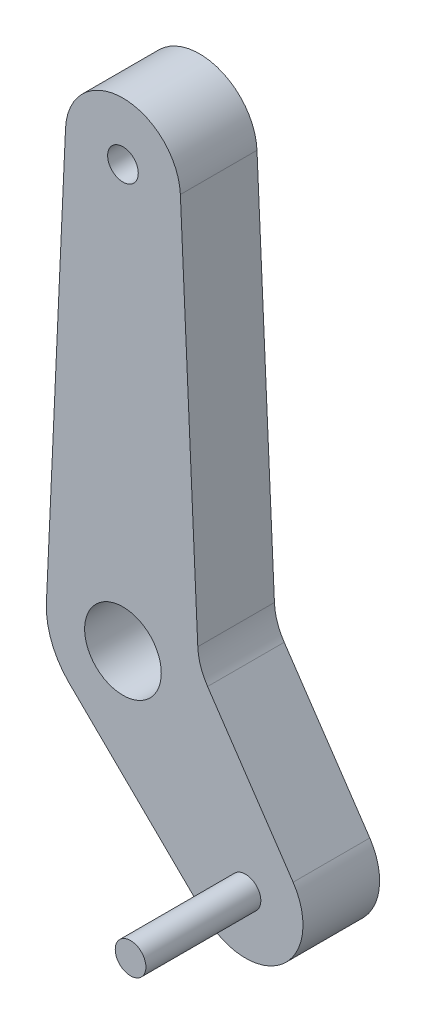
ISO-10303-21;
HEADER;
FILE_DESCRIPTION(('STEP AP214'),'2;1');
FILE_NAME('part.step','',(''),(''),'','','');
FILE_SCHEMA(('AUTOMOTIVE_DESIGN { 1 0 10303 214 1 1 1 1 }'));
ENDSEC;
DATA;
#1=APPLICATION_CONTEXT('core data for automotive mechanical design processes');
#2=APPLICATION_PROTOCOL_DEFINITION('international standard','automotive_design',2000,#1);
#3=PRODUCT_CONTEXT('',#1,'mechanical');
#4=PRODUCT('Part','Part','',(#3));
#5=PRODUCT_RELATED_PRODUCT_CATEGORY('part','',(#4));
#6=PRODUCT_DEFINITION_FORMATION('','',#4);
#7=PRODUCT_DEFINITION_CONTEXT('part definition',#1,'design');
#8=PRODUCT_DEFINITION('design','',#6,#7);
#9=PRODUCT_DEFINITION_SHAPE('','',#8);
#10=(LENGTH_UNIT() NAMED_UNIT(*) SI_UNIT(.MILLI.,.METRE.));
#11=(NAMED_UNIT(*) PLANE_ANGLE_UNIT() SI_UNIT($,.RADIAN.));
#12=(NAMED_UNIT(*) SI_UNIT($,.STERADIAN.) SOLID_ANGLE_UNIT());
#13=UNCERTAINTY_MEASURE_WITH_UNIT(LENGTH_MEASURE(1.E-05),#10,'distance_accuracy_value','');
#14=(GEOMETRIC_REPRESENTATION_CONTEXT(3) GLOBAL_UNCERTAINTY_ASSIGNED_CONTEXT((#13)) GLOBAL_UNIT_ASSIGNED_CONTEXT((#10,
#11,#12)) REPRESENTATION_CONTEXT('',''));
#15=CARTESIAN_POINT('',(0.,0.,0.));
#16=DIRECTION('',(0.,0.,1.));
#17=DIRECTION('',(1.,0.,0.));
#18=AXIS2_PLACEMENT_3D('',#15,#16,#17);
#19=CARTESIAN_POINT('',(34.5162567100584,11.4272183740973,20.));
#20=DIRECTION('',(0.,0.,-1.));
#21=DIRECTION('',(-1.,0.,0.));
#22=AXIS2_PLACEMENT_3D('',#19,#20,#21);
#23=PLANE('',#22);
#24=CARTESIAN_POINT('',(31.9853669723108,-38.4309289459233,20.));
#25=DIRECTION('',(0.,0.,-1.));
#26=DIRECTION('',(-1.,0.,0.));
#27=AXIS2_PLACEMENT_3D('',#24,#25,#26);
#28=CIRCLE('',#27,4.00000000000001);
#29=CARTESIAN_POINT('',(27.9853669723108,-38.4309289459233,20.));
#30=VERTEX_POINT('',#29);
#31=EDGE_CURVE('E11',#30,#30,#28,.F.);
#32=ORIENTED_EDGE('',*,*,#31,.F.);
#33=EDGE_LOOP('',(#32));
#34=FACE_BOUND('',#33,.T.);
#35=CARTESIAN_POINT('',(34.5162567100584,11.4272183740973,20.));
#36=DIRECTION('',(0.,0.,-1.));
#37=DIRECTION('',(-1.,0.,0.));
#38=AXIS2_PLACEMENT_3D('',#35,#36,#37);
#39=CIRCLE('',#38,15.);
#40=CARTESIAN_POINT('',(22.0852082516299,3.03263474986665,20.));
#41=VERTEX_POINT('',#40);
#42=CARTESIAN_POINT('',(19.5317605901703,10.7454001922791,20.));
#43=VERTEX_POINT('',#42);
#44=EDGE_CURVE('E171',#41,#43,#39,.T.);
#45=ORIENTED_EDGE('',*,*,#44,.T.);
#46=DIRECTION('',(-0.0454545454545449,0.998966407992541,0.));
#47=VECTOR('',#46,1.);
#48=CARTESIAN_POINT('',(14.9844961198881,110.681818181818,20.));
#49=LINE('',#48,#47);
#50=CARTESIAN_POINT('',(14.9844961198881,110.681818181818,20.));
#51=VERTEX_POINT('',#50);
#52=EDGE_CURVE('E107',#43,#51,#49,.T.);
#53=ORIENTED_EDGE('',*,*,#52,.T.);
#54=CARTESIAN_POINT('',(0.,110.,20.));
#55=DIRECTION('',(0.,0.,1.));
#56=DIRECTION('',(1.,0.,0.));
#57=AXIS2_PLACEMENT_3D('',#54,#55,#56);
#58=CIRCLE('',#57,15.);
#59=CARTESIAN_POINT('',(-14.9844961198881,110.681818181818,20.));
#60=VERTEX_POINT('',#59);
#61=EDGE_CURVE('E211',#51,#60,#58,.T.);
#62=ORIENTED_EDGE('',*,*,#61,.T.);
#63=DIRECTION('',(-0.0454545454545454,-0.998966407992541,0.));
#64=VECTOR('',#63,1.);
#65=CARTESIAN_POINT('',(-14.9844961198881,110.681818181818,20.));
#66=LINE('',#65,#64);
#67=CARTESIAN_POINT('',(-19.9793281598508,0.909090909090913,20.));
#68=VERTEX_POINT('',#67);
#69=EDGE_CURVE('E209',#60,#68,#66,.T.);
#70=ORIENTED_EDGE('',*,*,#69,.T.);
#71=CARTESIAN_POINT('',(0.,0.,20.));
#72=DIRECTION('',(0.,0.,1.));
#73=DIRECTION('',(1.,0.,0.));
#74=AXIS2_PLACEMENT_3D('',#71,#72,#73);
#75=CIRCLE('',#74,20.);
#76=CARTESIAN_POINT('',(-14.0159019201199,-14.2672524813146,20.));
#77=VERTEX_POINT('',#76);
#78=EDGE_CURVE('E126',#68,#77,#75,.T.);
#79=ORIENTED_EDGE('',*,*,#78,.T.);
#80=DIRECTION('',(0.713362624065732,-0.700795096005996,0.));
#81=VECTOR('',#80,1.);
#82=CARTESIAN_POINT('',(-14.0159019201199,-14.2672524813146,20.));
#83=LINE('',#82,#81);
#84=CARTESIAN_POINT('',(21.4734405322209,-49.1313683069093,20.));
#85=VERTEX_POINT('',#84);
#86=EDGE_CURVE('E120',#77,#85,#83,.T.);
#87=ORIENTED_EDGE('',*,*,#86,.T.);
#88=CARTESIAN_POINT('',(31.9853669723108,-38.4309289459233,20.));
#89=DIRECTION('',(0.,0.,1.));
#90=DIRECTION('',(1.,0.,0.));
#91=AXIS2_PLACEMENT_3D('',#88,#89,#90);
#92=CIRCLE('',#91,15.);
#93=CARTESIAN_POINT('',(44.4164154307394,-30.0363453216928,20.));
#94=VERTEX_POINT('',#93);
#95=EDGE_CURVE('E124',#85,#94,#92,.T.);
#96=ORIENTED_EDGE('',*,*,#95,.T.);
#97=DIRECTION('',(-0.559638908282038,0.82873656389524,0.));
#98=VECTOR('',#97,1.);
#99=CARTESIAN_POINT('',(44.4164154307394,-30.0363453216928,20.));
#100=LINE('',#99,#98);
#101=EDGE_CURVE('E63',#94,#41,#100,.T.);
#102=ORIENTED_EDGE('',*,*,#101,.T.);
#103=EDGE_LOOP('',(#45,#53,#62,#70,#79,#87,#96,#102));
#104=FACE_BOUND('',#103,.T.);
#105=CARTESIAN_POINT('',(0.,0.,20.));
#106=DIRECTION('',(0.,0.,1.));
#107=DIRECTION('',(1.,0.,0.));
#108=AXIS2_PLACEMENT_3D('',#105,#106,#107);
#109=CIRCLE('',#108,10.);
#110=CARTESIAN_POINT('',(10.,0.,20.));
#111=VERTEX_POINT('',#110);
#112=EDGE_CURVE('E153',#111,#111,#109,.T.);
#113=ORIENTED_EDGE('',*,*,#112,.F.);
#114=EDGE_LOOP('',(#113));
#115=FACE_BOUND('',#114,.T.);
#116=CARTESIAN_POINT('',(0.,110.,20.));
#117=DIRECTION('',(0.,0.,1.));
#118=DIRECTION('',(1.,0.,0.));
#119=AXIS2_PLACEMENT_3D('',#116,#117,#118);
#120=CIRCLE('',#119,4.);
#121=CARTESIAN_POINT('',(4.,110.,20.));
#122=VERTEX_POINT('',#121);
#123=EDGE_CURVE('E225',#122,#122,#120,.T.);
#124=ORIENTED_EDGE('',*,*,#123,.F.);
#125=EDGE_LOOP('',(#124));
#126=FACE_BOUND('',#125,.T.);
#127=ADVANCED_FACE('F45',(#34,#104,#115,#126),#23,.F.);
#128=CARTESIAN_POINT('',(34.5162567100584,11.4272183740973,0.));
#129=DIRECTION('',(0.,0.,-1.));
#130=DIRECTION('',(-1.,0.,0.));
#131=AXIS2_PLACEMENT_3D('',#128,#129,#130);
#132=PLANE('',#131);
#133=CARTESIAN_POINT('',(0.,0.,0.));
#134=DIRECTION('',(0.,0.,1.));
#135=DIRECTION('',(1.,0.,0.));
#136=AXIS2_PLACEMENT_3D('',#133,#134,#135);
#137=CIRCLE('',#136,10.);
#138=CARTESIAN_POINT('',(10.,0.,0.));
#139=VERTEX_POINT('',#138);
#140=EDGE_CURVE('E221',#139,#139,#137,.T.);
#141=ORIENTED_EDGE('',*,*,#140,.T.);
#142=EDGE_LOOP('',(#141));
#143=FACE_BOUND('',#142,.T.);
#144=CARTESIAN_POINT('',(34.5162567100584,11.4272183740973,0.));
#145=DIRECTION('',(0.,0.,-1.));
#146=DIRECTION('',(-1.,0.,0.));
#147=AXIS2_PLACEMENT_3D('',#144,#145,#146);
#148=CIRCLE('',#147,15.);
#149=CARTESIAN_POINT('',(22.0852082516299,3.03263474986665,0.));
#150=VERTEX_POINT('',#149);
#151=CARTESIAN_POINT('',(19.5317605901703,10.7454001922791,0.));
#152=VERTEX_POINT('',#151);
#153=EDGE_CURVE('E148',#150,#152,#148,.T.);
#154=ORIENTED_EDGE('',*,*,#153,.F.);
#155=DIRECTION('',(-0.559638908282038,0.82873656389524,0.));
#156=VECTOR('',#155,1.);
#157=CARTESIAN_POINT('',(44.4164154307394,-30.0363453216928,0.));
#158=LINE('',#157,#156);
#159=CARTESIAN_POINT('',(44.4164154307394,-30.0363453216928,0.));
#160=VERTEX_POINT('',#159);
#161=EDGE_CURVE('E98',#160,#150,#158,.T.);
#162=ORIENTED_EDGE('',*,*,#161,.F.);
#163=CARTESIAN_POINT('',(31.9853669723108,-38.4309289459233,0.));
#164=DIRECTION('',(0.,0.,1.));
#165=DIRECTION('',(1.,0.,0.));
#166=AXIS2_PLACEMENT_3D('',#163,#164,#165);
#167=CIRCLE('',#166,15.);
#168=CARTESIAN_POINT('',(21.4734405322209,-49.1313683069093,0.));
#169=VERTEX_POINT('',#168);
#170=EDGE_CURVE('E92',#169,#160,#167,.T.);
#171=ORIENTED_EDGE('',*,*,#170,.F.);
#172=DIRECTION('',(0.713362624065732,-0.700795096005996,0.));
#173=VECTOR('',#172,1.);
#174=CARTESIAN_POINT('',(-14.0159019201199,-14.2672524813146,0.));
#175=LINE('',#174,#173);
#176=CARTESIAN_POINT('',(-14.0159019201199,-14.2672524813146,0.));
#177=VERTEX_POINT('',#176);
#178=EDGE_CURVE('E135',#177,#169,#175,.T.);
#179=ORIENTED_EDGE('',*,*,#178,.F.);
#180=CARTESIAN_POINT('',(0.,0.,0.));
#181=DIRECTION('',(0.,0.,1.));
#182=DIRECTION('',(1.,0.,0.));
#183=AXIS2_PLACEMENT_3D('',#180,#181,#182);
#184=CIRCLE('',#183,20.);
#185=CARTESIAN_POINT('',(-19.9793281598508,0.909090909090913,0.));
#186=VERTEX_POINT('',#185);
#187=EDGE_CURVE('E162',#186,#177,#184,.T.);
#188=ORIENTED_EDGE('',*,*,#187,.F.);
#189=DIRECTION('',(-0.0454545454545454,-0.998966407992541,0.));
#190=VECTOR('',#189,1.);
#191=CARTESIAN_POINT('',(-14.9844961198881,110.681818181818,0.));
#192=LINE('',#191,#190);
#193=CARTESIAN_POINT('',(-14.9844961198881,110.681818181818,0.));
#194=VERTEX_POINT('',#193);
#195=EDGE_CURVE('E159',#194,#186,#192,.T.);
#196=ORIENTED_EDGE('',*,*,#195,.F.);
#197=CARTESIAN_POINT('',(0.,110.,0.));
#198=DIRECTION('',(0.,0.,1.));
#199=DIRECTION('',(1.,0.,0.));
#200=AXIS2_PLACEMENT_3D('',#197,#198,#199);
#201=CIRCLE('',#200,15.);
#202=CARTESIAN_POINT('',(14.9844961198881,110.681818181818,0.));
#203=VERTEX_POINT('',#202);
#204=EDGE_CURVE('E156',#203,#194,#201,.T.);
#205=ORIENTED_EDGE('',*,*,#204,.F.);
#206=DIRECTION('',(-0.0454545454545449,0.998966407992541,0.));
#207=VECTOR('',#206,1.);
#208=CARTESIAN_POINT('',(14.9844961198881,110.681818181818,0.));
#209=LINE('',#208,#207);
#210=EDGE_CURVE('E152',#152,#203,#209,.T.);
#211=ORIENTED_EDGE('',*,*,#210,.F.);
#212=EDGE_LOOP('',(#154,#162,#171,#179,#188,#196,#205,#211));
#213=FACE_BOUND('',#212,.T.);
#214=CARTESIAN_POINT('',(0.,110.,0.));
#215=DIRECTION('',(0.,0.,1.));
#216=DIRECTION('',(1.,0.,0.));
#217=AXIS2_PLACEMENT_3D('',#214,#215,#216);
#218=CIRCLE('',#217,4.);
#219=CARTESIAN_POINT('',(4.,110.,0.));
#220=VERTEX_POINT('',#219);
#221=EDGE_CURVE('E229',#220,#220,#218,.T.);
#222=ORIENTED_EDGE('',*,*,#221,.T.);
#223=EDGE_LOOP('',(#222));
#224=FACE_BOUND('',#223,.T.);
#225=ADVANCED_FACE('F196',(#143,#213,#224),#132,.T.);
#226=CARTESIAN_POINT('',(34.5162567100584,11.4272183740973,20.));
#227=DIRECTION('',(0.,0.,-1.));
#228=DIRECTION('',(-1.,0.,0.));
#229=AXIS2_PLACEMENT_3D('',#226,#227,#228);
#230=CYLINDRICAL_SURFACE('',#229,15.);
#231=ORIENTED_EDGE('',*,*,#153,.T.);
#232=DIRECTION('',(0.,0.,-1.));
#233=VECTOR('',#232,1.);
#234=CARTESIAN_POINT('',(19.5317605901703,10.7454001922791,20.));
#235=LINE('',#234,#233);
#236=EDGE_CURVE('E55',#43,#152,#235,.T.);
#237=ORIENTED_EDGE('',*,*,#236,.F.);
#238=ORIENTED_EDGE('',*,*,#44,.F.);
#239=DIRECTION('',(0.,0.,-1.));
#240=VECTOR('',#239,1.);
#241=CARTESIAN_POINT('',(22.0852082516299,3.03263474986665,20.));
#242=LINE('',#241,#240);
#243=EDGE_CURVE('E144',#41,#150,#242,.T.);
#244=ORIENTED_EDGE('',*,*,#243,.T.);
#245=EDGE_LOOP('',(#231,#237,#238,#244));
#246=FACE_BOUND('',#245,.T.);
#247=ADVANCED_FACE('F47',(#246),#230,.F.);
#248=CARTESIAN_POINT('',(14.9844961198881,110.681818181818,20.));
#249=DIRECTION('',(-0.998966407992541,-0.0454545454545449,0.));
#250=DIRECTION('',(0.0454545454545449,-0.998966407992541,0.));
#251=AXIS2_PLACEMENT_3D('',#248,#249,#250);
#252=PLANE('',#251);
#253=ORIENTED_EDGE('',*,*,#210,.T.);
#254=DIRECTION('',(0.,0.,-1.));
#255=VECTOR('',#254,1.);
#256=CARTESIAN_POINT('',(14.9844961198881,110.681818181818,20.));
#257=LINE('',#256,#255);
#258=EDGE_CURVE('E186',#51,#203,#257,.T.);
#259=ORIENTED_EDGE('',*,*,#258,.F.);
#260=ORIENTED_EDGE('',*,*,#52,.F.);
#261=ORIENTED_EDGE('',*,*,#236,.T.);
#262=EDGE_LOOP('',(#253,#259,#260,#261));
#263=FACE_BOUND('',#262,.T.);
#264=ADVANCED_FACE('F191',(#263),#252,.F.);
#265=CARTESIAN_POINT('',(0.,110.,20.));
#266=DIRECTION('',(0.,0.,-1.));
#267=DIRECTION('',(-1.,0.,0.));
#268=AXIS2_PLACEMENT_3D('',#265,#266,#267);
#269=CYLINDRICAL_SURFACE('',#268,15.);
#270=ORIENTED_EDGE('',*,*,#204,.T.);
#271=DIRECTION('',(0.,0.,-1.));
#272=VECTOR('',#271,1.);
#273=CARTESIAN_POINT('',(-14.9844961198881,110.681818181818,20.));
#274=LINE('',#273,#272);
#275=EDGE_CURVE('E182',#60,#194,#274,.T.);
#276=ORIENTED_EDGE('',*,*,#275,.F.);
#277=ORIENTED_EDGE('',*,*,#61,.F.);
#278=ORIENTED_EDGE('',*,*,#258,.T.);
#279=EDGE_LOOP('',(#270,#276,#277,#278));
#280=FACE_BOUND('',#279,.T.);
#281=ADVANCED_FACE('F203',(#280),#269,.T.);
#282=CARTESIAN_POINT('',(-14.9844961198881,110.681818181818,20.));
#283=DIRECTION('',(0.998966407992541,-0.0454545454545454,0.));
#284=DIRECTION('',(0.0454545454545454,0.998966407992541,0.));
#285=AXIS2_PLACEMENT_3D('',#282,#283,#284);
#286=PLANE('',#285);
#287=ORIENTED_EDGE('',*,*,#195,.T.);
#288=DIRECTION('',(0.,0.,-1.));
#289=VECTOR('',#288,1.);
#290=CARTESIAN_POINT('',(-19.9793281598508,0.909090909090913,20.));
#291=LINE('',#290,#289);
#292=EDGE_CURVE('E178',#68,#186,#291,.T.);
#293=ORIENTED_EDGE('',*,*,#292,.F.);
#294=ORIENTED_EDGE('',*,*,#69,.F.);
#295=ORIENTED_EDGE('',*,*,#275,.T.);
#296=EDGE_LOOP('',(#287,#293,#294,#295));
#297=FACE_BOUND('',#296,.T.);
#298=ADVANCED_FACE('F207',(#297),#286,.F.);
#299=CARTESIAN_POINT('',(0.,0.,20.));
#300=DIRECTION('',(0.,0.,-1.));
#301=DIRECTION('',(-1.,0.,0.));
#302=AXIS2_PLACEMENT_3D('',#299,#300,#301);
#303=CYLINDRICAL_SURFACE('',#302,20.);
#304=ORIENTED_EDGE('',*,*,#187,.T.);
#305=DIRECTION('',(0.,0.,-1.));
#306=VECTOR('',#305,1.);
#307=CARTESIAN_POINT('',(-14.0159019201199,-14.2672524813146,20.));
#308=LINE('',#307,#306);
#309=EDGE_CURVE('E137',#77,#177,#308,.T.);
#310=ORIENTED_EDGE('',*,*,#309,.F.);
#311=ORIENTED_EDGE('',*,*,#78,.F.);
#312=ORIENTED_EDGE('',*,*,#292,.T.);
#313=EDGE_LOOP('',(#304,#310,#311,#312));
#314=FACE_BOUND('',#313,.T.);
#315=ADVANCED_FACE('F269',(#314),#303,.T.);
#316=CARTESIAN_POINT('',(-14.0159019201199,-14.2672524813146,20.));
#317=DIRECTION('',(0.700795096005996,0.713362624065732,0.));
#318=DIRECTION('',(-0.713362624065732,0.700795096005996,0.));
#319=AXIS2_PLACEMENT_3D('',#316,#317,#318);
#320=PLANE('',#319);
#321=ORIENTED_EDGE('',*,*,#178,.T.);
#322=DIRECTION('',(0.,0.,-1.));
#323=VECTOR('',#322,1.);
#324=CARTESIAN_POINT('',(21.4734405322209,-49.1313683069093,20.));
#325=LINE('',#324,#323);
#326=EDGE_CURVE('E132',#85,#169,#325,.T.);
#327=ORIENTED_EDGE('',*,*,#326,.F.);
#328=ORIENTED_EDGE('',*,*,#86,.F.);
#329=ORIENTED_EDGE('',*,*,#309,.T.);
#330=EDGE_LOOP('',(#321,#327,#328,#329));
#331=FACE_BOUND('',#330,.T.);
#332=ADVANCED_FACE('F133',(#331),#320,.F.);
#333=CARTESIAN_POINT('',(31.9853669723108,-38.4309289459233,20.));
#334=DIRECTION('',(0.,0.,-1.));
#335=DIRECTION('',(-1.,0.,0.));
#336=AXIS2_PLACEMENT_3D('',#333,#334,#335);
#337=CYLINDRICAL_SURFACE('',#336,15.);
#338=ORIENTED_EDGE('',*,*,#170,.T.);
#339=DIRECTION('',(0.,0.,-1.));
#340=VECTOR('',#339,1.);
#341=CARTESIAN_POINT('',(44.4164154307394,-30.0363453216928,20.));
#342=LINE('',#341,#340);
#343=EDGE_CURVE('E138',#94,#160,#342,.T.);
#344=ORIENTED_EDGE('',*,*,#343,.F.);
#345=ORIENTED_EDGE('',*,*,#95,.F.);
#346=ORIENTED_EDGE('',*,*,#326,.T.);
#347=EDGE_LOOP('',(#338,#344,#345,#346));
#348=FACE_BOUND('',#347,.T.);
#349=ADVANCED_FACE('F140',(#348),#337,.T.);
#350=CARTESIAN_POINT('',(44.4164154307394,-30.0363453216928,20.));
#351=DIRECTION('',(-0.82873656389524,-0.559638908282038,0.));
#352=DIRECTION('',(0.559638908282038,-0.82873656389524,0.));
#353=AXIS2_PLACEMENT_3D('',#350,#351,#352);
#354=PLANE('',#353);
#355=ORIENTED_EDGE('',*,*,#161,.T.);
#356=ORIENTED_EDGE('',*,*,#243,.F.);
#357=ORIENTED_EDGE('',*,*,#101,.F.);
#358=ORIENTED_EDGE('',*,*,#343,.T.);
#359=EDGE_LOOP('',(#355,#356,#357,#358));
#360=FACE_BOUND('',#359,.T.);
#361=ADVANCED_FACE('F262',(#360),#354,.F.);
#362=CARTESIAN_POINT('',(0.,0.,20.));
#363=DIRECTION('',(0.,0.,-1.));
#364=DIRECTION('',(-1.,0.,0.));
#365=AXIS2_PLACEMENT_3D('',#362,#363,#364);
#366=CYLINDRICAL_SURFACE('',#365,10.);
#367=ORIENTED_EDGE('',*,*,#112,.T.);
#368=EDGE_LOOP('',(#367));
#369=FACE_BOUND('',#368,.T.);
#370=ORIENTED_EDGE('',*,*,#140,.F.);
#371=EDGE_LOOP('',(#370));
#372=FACE_BOUND('',#371,.T.);
#373=ADVANCED_FACE('F259',(#369,#372),#366,.F.);
#374=CARTESIAN_POINT('',(0.,110.,20.));
#375=DIRECTION('',(0.,0.,-1.));
#376=DIRECTION('',(-1.,0.,0.));
#377=AXIS2_PLACEMENT_3D('',#374,#375,#376);
#378=CYLINDRICAL_SURFACE('',#377,4.);
#379=ORIENTED_EDGE('',*,*,#123,.T.);
#380=EDGE_LOOP('',(#379));
#381=FACE_BOUND('',#380,.T.);
#382=ORIENTED_EDGE('',*,*,#221,.F.);
#383=EDGE_LOOP('',(#382));
#384=FACE_BOUND('',#383,.T.);
#385=ADVANCED_FACE('F246',(#381,#384),#378,.F.);
#386=CARTESIAN_POINT('',(31.9853669723108,-38.4309289459233,50.));
#387=DIRECTION('',(0.,0.,-1.));
#388=DIRECTION('',(-1.,0.,0.));
#389=AXIS2_PLACEMENT_3D('',#386,#387,#388);
#390=CYLINDRICAL_SURFACE('',#389,4.00000000000001);
#391=CARTESIAN_POINT('',(31.9853669723108,-38.4309289459233,50.));
#392=DIRECTION('',(0.,0.,1.));
#393=DIRECTION('',(1.,0.,0.));
#394=AXIS2_PLACEMENT_3D('',#391,#392,#393);
#395=CIRCLE('',#394,4.00000000000001);
#396=CARTESIAN_POINT('',(35.9853669723108,-38.4309289459233,50.));
#397=VERTEX_POINT('',#396);
#398=EDGE_CURVE('E233',#397,#397,#395,.T.);
#399=ORIENTED_EDGE('',*,*,#398,.F.);
#400=EDGE_LOOP('',(#399));
#401=FACE_BOUND('',#400,.T.);
#402=ORIENTED_EDGE('',*,*,#31,.T.);
#403=EDGE_LOOP('',(#402));
#404=FACE_BOUND('',#403,.T.);
#405=ADVANCED_FACE('F243',(#401,#404),#390,.T.);
#406=CARTESIAN_POINT('',(31.9853669723108,-38.4309289459233,50.));
#407=DIRECTION('',(0.,0.,1.));
#408=DIRECTION('',(1.,0.,0.));
#409=AXIS2_PLACEMENT_3D('',#406,#407,#408);
#410=PLANE('',#409);
#411=ORIENTED_EDGE('',*,*,#398,.T.);
#412=EDGE_LOOP('',(#411));
#413=FACE_BOUND('',#412,.T.);
#414=ADVANCED_FACE('F241',(#413),#410,.T.);
#415=CLOSED_SHELL('',(#127,#225,#247,#264,#281,#298,#315,#332,#349,#361,#373,#385,#405,#414));
#416=MANIFOLD_SOLID_BREP('B2',#415);
#417=ADVANCED_BREP_SHAPE_REPRESENTATION('',(#18,#416),#14);
#418=SHAPE_DEFINITION_REPRESENTATION(#9,#417);
ENDSEC;
END-ISO-10303-21;
